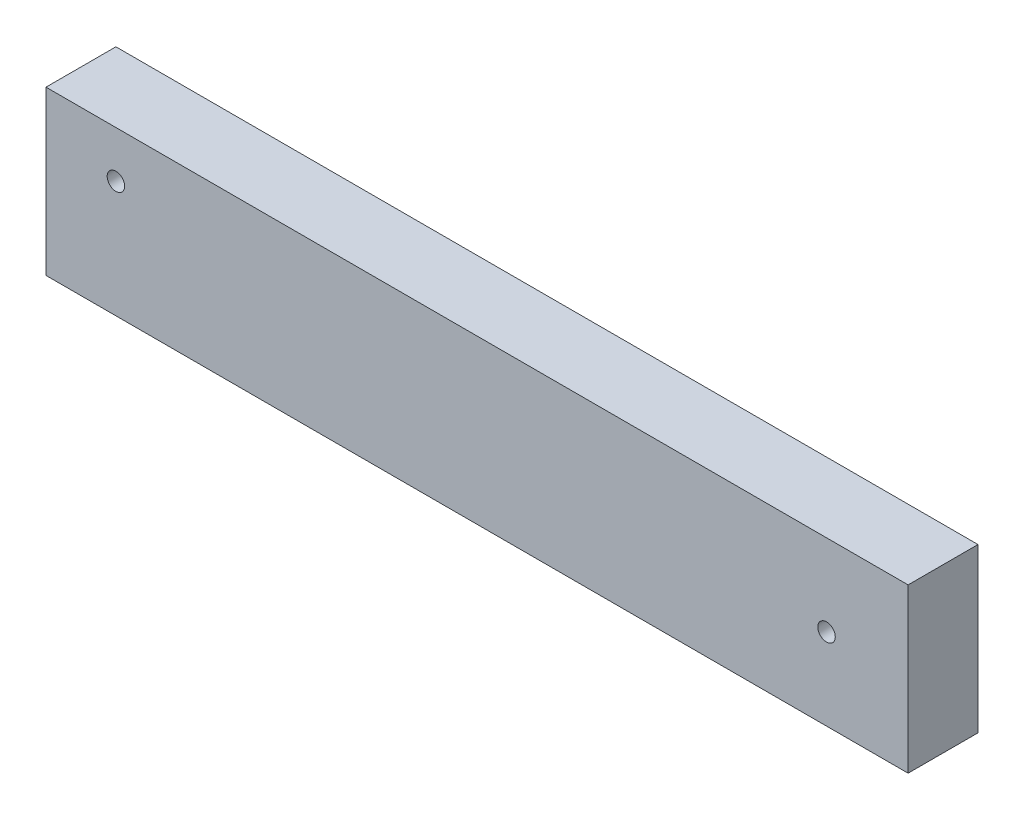
ISO-10303-21;
HEADER;
FILE_DESCRIPTION(('STEP AP214'),'2;1');
FILE_NAME('part.step','',(''),(''),'','','');
FILE_SCHEMA(('AUTOMOTIVE_DESIGN { 1 0 10303 214 1 1 1 1 }'));
ENDSEC;
DATA;
#1=APPLICATION_CONTEXT('core data for automotive mechanical design processes');
#2=APPLICATION_PROTOCOL_DEFINITION('international standard','automotive_design',2000,#1);
#3=PRODUCT_CONTEXT('',#1,'mechanical');
#4=PRODUCT('Part','Part','',(#3));
#5=PRODUCT_RELATED_PRODUCT_CATEGORY('part','',(#4));
#6=PRODUCT_DEFINITION_FORMATION('','',#4);
#7=PRODUCT_DEFINITION_CONTEXT('part definition',#1,'design');
#8=PRODUCT_DEFINITION('design','',#6,#7);
#9=PRODUCT_DEFINITION_SHAPE('','',#8);
#10=(LENGTH_UNIT() NAMED_UNIT(*) SI_UNIT(.MILLI.,.METRE.));
#11=(NAMED_UNIT(*) PLANE_ANGLE_UNIT() SI_UNIT($,.RADIAN.));
#12=(NAMED_UNIT(*) SI_UNIT($,.STERADIAN.) SOLID_ANGLE_UNIT());
#13=UNCERTAINTY_MEASURE_WITH_UNIT(LENGTH_MEASURE(1.E-05),#10,'distance_accuracy_value','');
#14=(GEOMETRIC_REPRESENTATION_CONTEXT(3) GLOBAL_UNCERTAINTY_ASSIGNED_CONTEXT((#13)) GLOBAL_UNIT_ASSIGNED_CONTEXT((#10,
#11,#12)) REPRESENTATION_CONTEXT('',''));
#15=CARTESIAN_POINT('',(0.,0.,0.));
#16=DIRECTION('',(0.,0.,1.));
#17=DIRECTION('',(1.,0.,0.));
#18=AXIS2_PLACEMENT_3D('',#15,#16,#17);
#19=CARTESIAN_POINT('',(0.,0.,38.1));
#20=DIRECTION('',(1.,0.,0.));
#21=DIRECTION('',(0.,0.,-1.));
#22=AXIS2_PLACEMENT_3D('',#19,#20,#21);
#23=PLANE('',#22);
#24=DIRECTION('',(0.,-1.,0.));
#25=VECTOR('',#24,1.);
#26=CARTESIAN_POINT('',(0.,0.,0.));
#27=LINE('',#26,#25);
#28=CARTESIAN_POINT('',(0.,88.9,0.));
#29=VERTEX_POINT('',#28);
#30=CARTESIAN_POINT('',(0.,0.,0.));
#31=VERTEX_POINT('',#30);
#32=EDGE_CURVE('E107',#29,#31,#27,.T.);
#33=ORIENTED_EDGE('',*,*,#32,.T.);
#34=DIRECTION('',(0.,0.,-1.));
#35=VECTOR('',#34,1.);
#36=CARTESIAN_POINT('',(0.,0.,38.1));
#37=LINE('',#36,#35);
#38=CARTESIAN_POINT('',(0.,0.,38.1));
#39=VERTEX_POINT('',#38);
#40=EDGE_CURVE('E11',#39,#31,#37,.T.);
#41=ORIENTED_EDGE('',*,*,#40,.F.);
#42=DIRECTION('',(0.,-1.,0.));
#43=VECTOR('',#42,1.);
#44=CARTESIAN_POINT('',(0.,0.,38.1));
#45=LINE('',#44,#43);
#46=CARTESIAN_POINT('',(0.,88.9,38.1));
#47=VERTEX_POINT('',#46);
#48=EDGE_CURVE('E91',#47,#39,#45,.T.);
#49=ORIENTED_EDGE('',*,*,#48,.F.);
#50=DIRECTION('',(0.,0.,-1.));
#51=VECTOR('',#50,1.);
#52=CARTESIAN_POINT('',(0.,88.9,38.1));
#53=LINE('',#52,#51);
#54=EDGE_CURVE('E103',#47,#29,#53,.T.);
#55=ORIENTED_EDGE('',*,*,#54,.T.);
#56=EDGE_LOOP('',(#33,#41,#49,#55));
#57=FACE_BOUND('',#56,.T.);
#58=ADVANCED_FACE('F39',(#57),#23,.F.);
#59=CARTESIAN_POINT('',(0.,0.,38.1));
#60=DIRECTION('',(0.,1.,0.));
#61=DIRECTION('',(0.,0.,1.));
#62=AXIS2_PLACEMENT_3D('',#59,#60,#61);
#63=PLANE('',#62);
#64=DIRECTION('',(1.,0.,0.));
#65=VECTOR('',#64,1.);
#66=CARTESIAN_POINT('',(0.,0.,0.));
#67=LINE('',#66,#65);
#68=CARTESIAN_POINT('',(469.9,0.,0.));
#69=VERTEX_POINT('',#68);
#70=EDGE_CURVE('E96',#31,#69,#67,.T.);
#71=ORIENTED_EDGE('',*,*,#70,.T.);
#72=DIRECTION('',(0.,0.,-1.));
#73=VECTOR('',#72,1.);
#74=CARTESIAN_POINT('',(469.9,0.,38.1));
#75=LINE('',#74,#73);
#76=CARTESIAN_POINT('',(469.9,0.,38.1));
#77=VERTEX_POINT('',#76);
#78=EDGE_CURVE('E48',#77,#69,#75,.T.);
#79=ORIENTED_EDGE('',*,*,#78,.F.);
#80=DIRECTION('',(1.,0.,0.));
#81=VECTOR('',#80,1.);
#82=CARTESIAN_POINT('',(0.,0.,38.1));
#83=LINE('',#82,#81);
#84=EDGE_CURVE('E86',#39,#77,#83,.T.);
#85=ORIENTED_EDGE('',*,*,#84,.F.);
#86=ORIENTED_EDGE('',*,*,#40,.T.);
#87=EDGE_LOOP('',(#71,#79,#85,#86));
#88=FACE_BOUND('',#87,.T.);
#89=ADVANCED_FACE('F95',(#88),#63,.F.);
#90=CARTESIAN_POINT('',(469.9,0.,38.1));
#91=DIRECTION('',(-1.,0.,0.));
#92=DIRECTION('',(0.,0.,1.));
#93=AXIS2_PLACEMENT_3D('',#90,#91,#92);
#94=PLANE('',#93);
#95=DIRECTION('',(0.,1.,0.));
#96=VECTOR('',#95,1.);
#97=CARTESIAN_POINT('',(469.9,0.,0.));
#98=LINE('',#97,#96);
#99=CARTESIAN_POINT('',(469.9,88.9,0.));
#100=VERTEX_POINT('',#99);
#101=EDGE_CURVE('E73',#69,#100,#98,.T.);
#102=ORIENTED_EDGE('',*,*,#101,.T.);
#103=DIRECTION('',(0.,0.,-1.));
#104=VECTOR('',#103,1.);
#105=CARTESIAN_POINT('',(469.9,88.9,38.1));
#106=LINE('',#105,#104);
#107=CARTESIAN_POINT('',(469.9,88.9,38.1));
#108=VERTEX_POINT('',#107);
#109=EDGE_CURVE('E98',#108,#100,#106,.T.);
#110=ORIENTED_EDGE('',*,*,#109,.F.);
#111=DIRECTION('',(0.,1.,0.));
#112=VECTOR('',#111,1.);
#113=CARTESIAN_POINT('',(469.9,0.,38.1));
#114=LINE('',#113,#112);
#115=EDGE_CURVE('E89',#77,#108,#114,.T.);
#116=ORIENTED_EDGE('',*,*,#115,.F.);
#117=ORIENTED_EDGE('',*,*,#78,.T.);
#118=EDGE_LOOP('',(#102,#110,#116,#117));
#119=FACE_BOUND('',#118,.T.);
#120=ADVANCED_FACE('F99',(#119),#94,.F.);
#121=CARTESIAN_POINT('',(0.,88.9,38.1));
#122=DIRECTION('',(0.,-1.,0.));
#123=DIRECTION('',(0.,0.,-1.));
#124=AXIS2_PLACEMENT_3D('',#121,#122,#123);
#125=PLANE('',#124);
#126=DIRECTION('',(-1.,0.,0.));
#127=VECTOR('',#126,1.);
#128=CARTESIAN_POINT('',(0.,88.9,0.));
#129=LINE('',#128,#127);
#130=EDGE_CURVE('E79',#100,#29,#129,.T.);
#131=ORIENTED_EDGE('',*,*,#130,.T.);
#132=ORIENTED_EDGE('',*,*,#54,.F.);
#133=DIRECTION('',(-1.,0.,0.));
#134=VECTOR('',#133,1.);
#135=CARTESIAN_POINT('',(0.,88.9,38.1));
#136=LINE('',#135,#134);
#137=EDGE_CURVE('E56',#108,#47,#136,.T.);
#138=ORIENTED_EDGE('',*,*,#137,.F.);
#139=ORIENTED_EDGE('',*,*,#109,.T.);
#140=EDGE_LOOP('',(#131,#132,#138,#139));
#141=FACE_BOUND('',#140,.T.);
#142=ADVANCED_FACE('F121',(#141),#125,.F.);
#143=CARTESIAN_POINT('',(0.,0.,38.1));
#144=DIRECTION('',(0.,0.,-1.));
#145=DIRECTION('',(-1.,0.,0.));
#146=AXIS2_PLACEMENT_3D('',#143,#144,#145);
#147=PLANE('',#146);
#148=CARTESIAN_POINT('',(38.1,63.5,38.1));
#149=DIRECTION('',(0.,0.,1.));
#150=DIRECTION('',(1.,0.,0.));
#151=AXIS2_PLACEMENT_3D('',#148,#149,#150);
#152=CIRCLE('',#151,4.7625);
#153=CARTESIAN_POINT('',(42.8625,63.5,38.1));
#154=VERTEX_POINT('',#153);
#155=EDGE_CURVE('E136',#154,#154,#152,.T.);
#156=ORIENTED_EDGE('',*,*,#155,.F.);
#157=EDGE_LOOP('',(#156));
#158=FACE_BOUND('',#157,.T.);
#159=CARTESIAN_POINT('',(425.45,44.45,38.1));
#160=DIRECTION('',(0.,0.,1.));
#161=DIRECTION('',(1.,0.,0.));
#162=AXIS2_PLACEMENT_3D('',#159,#160,#161);
#163=CIRCLE('',#162,4.76250000000001);
#164=CARTESIAN_POINT('',(430.2125,44.45,38.1));
#165=VERTEX_POINT('',#164);
#166=EDGE_CURVE('E128',#165,#165,#163,.T.);
#167=ORIENTED_EDGE('',*,*,#166,.F.);
#168=EDGE_LOOP('',(#167));
#169=FACE_BOUND('',#168,.T.);
#170=ORIENTED_EDGE('',*,*,#48,.T.);
#171=ORIENTED_EDGE('',*,*,#84,.T.);
#172=ORIENTED_EDGE('',*,*,#115,.T.);
#173=ORIENTED_EDGE('',*,*,#137,.T.);
#174=EDGE_LOOP('',(#170,#171,#172,#173));
#175=FACE_BOUND('',#174,.T.);
#176=ADVANCED_FACE('F87',(#158,#169,#175),#147,.F.);
#177=CARTESIAN_POINT('',(0.,0.,0.));
#178=DIRECTION('',(0.,0.,-1.));
#179=DIRECTION('',(-1.,0.,0.));
#180=AXIS2_PLACEMENT_3D('',#177,#178,#179);
#181=PLANE('',#180);
#182=CARTESIAN_POINT('',(38.1,63.5,0.));
#183=DIRECTION('',(0.,0.,1.));
#184=DIRECTION('',(1.,0.,0.));
#185=AXIS2_PLACEMENT_3D('',#182,#183,#184);
#186=CIRCLE('',#185,4.7625);
#187=CARTESIAN_POINT('',(42.8625,63.5,0.));
#188=VERTEX_POINT('',#187);
#189=EDGE_CURVE('E132',#188,#188,#186,.T.);
#190=ORIENTED_EDGE('',*,*,#189,.T.);
#191=EDGE_LOOP('',(#190));
#192=FACE_BOUND('',#191,.T.);
#193=CARTESIAN_POINT('',(425.45,44.45,0.));
#194=DIRECTION('',(0.,0.,1.));
#195=DIRECTION('',(1.,0.,0.));
#196=AXIS2_PLACEMENT_3D('',#193,#194,#195);
#197=CIRCLE('',#196,4.76250000000001);
#198=CARTESIAN_POINT('',(430.2125,44.45,0.));
#199=VERTEX_POINT('',#198);
#200=EDGE_CURVE('E111',#199,#199,#197,.T.);
#201=ORIENTED_EDGE('',*,*,#200,.T.);
#202=EDGE_LOOP('',(#201));
#203=FACE_BOUND('',#202,.T.);
#204=ORIENTED_EDGE('',*,*,#32,.F.);
#205=ORIENTED_EDGE('',*,*,#130,.F.);
#206=ORIENTED_EDGE('',*,*,#101,.F.);
#207=ORIENTED_EDGE('',*,*,#70,.F.);
#208=EDGE_LOOP('',(#204,#205,#206,#207));
#209=FACE_BOUND('',#208,.T.);
#210=ADVANCED_FACE('F124',(#192,#203,#209),#181,.T.);
#211=CARTESIAN_POINT('',(425.45,44.45,0.));
#212=DIRECTION('',(0.,0.,1.));
#213=DIRECTION('',(1.,0.,0.));
#214=AXIS2_PLACEMENT_3D('',#211,#212,#213);
#215=CYLINDRICAL_SURFACE('',#214,4.76250000000001);
#216=CARTESIAN_POINT('',(430.2125,44.45,0.));
#217=CARTESIAN_POINT('',(430.2125,44.45,0.396875));
#218=CARTESIAN_POINT('',(430.2125,44.45,0.79375));
#219=CARTESIAN_POINT('',(430.2125,44.45,1.5875));
#220=CARTESIAN_POINT('',(430.2125,44.45,1.984375));
#221=CARTESIAN_POINT('',(430.2125,44.45,2.778125));
#222=CARTESIAN_POINT('',(430.2125,44.45,3.175));
#223=CARTESIAN_POINT('',(430.2125,44.45,3.96875));
#224=CARTESIAN_POINT('',(430.2125,44.45,4.365625));
#225=CARTESIAN_POINT('',(430.2125,44.45,5.159375));
#226=CARTESIAN_POINT('',(430.2125,44.45,5.55625));
#227=CARTESIAN_POINT('',(430.2125,44.45,6.35));
#228=CARTESIAN_POINT('',(430.2125,44.45,6.746875));
#229=CARTESIAN_POINT('',(430.2125,44.45,7.540625));
#230=CARTESIAN_POINT('',(430.2125,44.45,7.9375));
#231=CARTESIAN_POINT('',(430.2125,44.45,8.73125));
#232=CARTESIAN_POINT('',(430.2125,44.45,9.128125));
#233=CARTESIAN_POINT('',(430.2125,44.45,9.921875));
#234=CARTESIAN_POINT('',(430.2125,44.45,10.31875));
#235=CARTESIAN_POINT('',(430.2125,44.45,11.1125));
#236=CARTESIAN_POINT('',(430.2125,44.45,11.509375));
#237=CARTESIAN_POINT('',(430.2125,44.45,12.303125));
#238=CARTESIAN_POINT('',(430.2125,44.45,12.7));
#239=CARTESIAN_POINT('',(430.2125,44.45,13.49375));
#240=CARTESIAN_POINT('',(430.2125,44.45,13.890625));
#241=CARTESIAN_POINT('',(430.2125,44.45,14.684375));
#242=CARTESIAN_POINT('',(430.2125,44.45,15.08125));
#243=CARTESIAN_POINT('',(430.2125,44.45,15.875));
#244=CARTESIAN_POINT('',(430.2125,44.45,16.271875));
#245=CARTESIAN_POINT('',(430.2125,44.45,17.065625));
#246=CARTESIAN_POINT('',(430.2125,44.45,17.4625));
#247=CARTESIAN_POINT('',(430.2125,44.45,18.25625));
#248=CARTESIAN_POINT('',(430.2125,44.45,18.653125));
#249=CARTESIAN_POINT('',(430.2125,44.45,19.446875));
#250=CARTESIAN_POINT('',(430.2125,44.45,19.84375));
#251=CARTESIAN_POINT('',(430.2125,44.45,20.6375));
#252=CARTESIAN_POINT('',(430.2125,44.45,21.034375));
#253=CARTESIAN_POINT('',(430.2125,44.45,21.828125));
#254=CARTESIAN_POINT('',(430.2125,44.45,22.225));
#255=CARTESIAN_POINT('',(430.2125,44.45,23.01875));
#256=CARTESIAN_POINT('',(430.2125,44.45,23.415625));
#257=CARTESIAN_POINT('',(430.2125,44.45,24.209375));
#258=CARTESIAN_POINT('',(430.2125,44.45,24.60625));
#259=CARTESIAN_POINT('',(430.2125,44.45,25.4));
#260=CARTESIAN_POINT('',(430.2125,44.45,25.796875));
#261=CARTESIAN_POINT('',(430.2125,44.45,26.590625));
#262=CARTESIAN_POINT('',(430.2125,44.45,26.9875));
#263=CARTESIAN_POINT('',(430.2125,44.45,27.78125));
#264=CARTESIAN_POINT('',(430.2125,44.45,28.178125));
#265=CARTESIAN_POINT('',(430.2125,44.45,28.971875));
#266=CARTESIAN_POINT('',(430.2125,44.45,29.36875));
#267=CARTESIAN_POINT('',(430.2125,44.45,30.1625));
#268=CARTESIAN_POINT('',(430.2125,44.45,30.559375));
#269=CARTESIAN_POINT('',(430.2125,44.45,31.353125));
#270=CARTESIAN_POINT('',(430.2125,44.45,31.75));
#271=CARTESIAN_POINT('',(430.2125,44.45,32.54375));
#272=CARTESIAN_POINT('',(430.2125,44.45,32.940625));
#273=CARTESIAN_POINT('',(430.2125,44.45,33.734375));
#274=CARTESIAN_POINT('',(430.2125,44.45,34.13125));
#275=CARTESIAN_POINT('',(430.2125,44.45,34.925));
#276=CARTESIAN_POINT('',(430.2125,44.45,35.321875));
#277=CARTESIAN_POINT('',(430.2125,44.45,36.115625));
#278=CARTESIAN_POINT('',(430.2125,44.45,36.5125));
#279=CARTESIAN_POINT('',(430.2125,44.45,37.30625));
#280=CARTESIAN_POINT('',(430.2125,44.45,37.703125));
#281=CARTESIAN_POINT('',(430.2125,44.45,38.1));
#282=B_SPLINE_CURVE_WITH_KNOTS('',3,(#216,#217,#218,#219,#220,#221,#222,#223,#224,#225,#226,
#227,#228,#229,#230,#231,#232,#233,#234,#235,#236,#237,#238,#239,#240,#241,#242,#243,#244,#245,
#246,#247,#248,#249,#250,#251,#252,#253,#254,#255,#256,#257,#258,#259,#260,#261,#262,#263,#264,
#265,#266,#267,#268,#269,#270,#271,#272,#273,#274,#275,#276,#277,#278,#279,#280,#281),
.UNSPECIFIED.,.F.,.F.,(4,2,2,2,2,2,2,2,2,2,2,2,2,2,2,2,2,2,2,2,2,2,2,2,2,2,2,2,2,2,2,2,4),(0.,
1.190625,2.38125,3.571875,4.7625,5.953125,7.14375,8.334375,9.525,10.715625,11.90625,13.096875,
14.2875,15.478125,16.66875,17.859375,19.05,20.240625,21.43125,22.621875,23.8125,25.003125,
26.19375,27.384375,28.575,29.765625,30.95625,32.146875,33.3375,34.528125,35.71875,36.909375,
38.1),.UNSPECIFIED.);
#283=EDGE_CURVE('BSEAM149',#199,#165,#282,.T.);
#284=ORIENTED_EDGE('',*,*,#200,.F.);
#285=ORIENTED_EDGE('',*,*,#166,.T.);
#286=ORIENTED_EDGE('',*,*,#283,.T.);
#287=ORIENTED_EDGE('',*,*,#283,.F.);
#288=EDGE_LOOP('',(#284,#286,#285,#287));
#289=FACE_BOUND('',#288,.T.);
#290=ADVANCED_FACE('F149',(#289),#215,.F.);
#291=CARTESIAN_POINT('',(38.1,63.5,0.));
#292=DIRECTION('',(0.,0.,1.));
#293=DIRECTION('',(1.,0.,0.));
#294=AXIS2_PLACEMENT_3D('',#291,#292,#293);
#295=CYLINDRICAL_SURFACE('',#294,4.7625);
#296=CARTESIAN_POINT('',(42.8625,63.5,0.));
#297=CARTESIAN_POINT('',(42.8625,63.5,0.396875));
#298=CARTESIAN_POINT('',(42.8625,63.5,0.79375));
#299=CARTESIAN_POINT('',(42.8625,63.5,1.5875));
#300=CARTESIAN_POINT('',(42.8625,63.5,1.984375));
#301=CARTESIAN_POINT('',(42.8625,63.5,2.778125));
#302=CARTESIAN_POINT('',(42.8625,63.5,3.175));
#303=CARTESIAN_POINT('',(42.8625,63.5,3.96875));
#304=CARTESIAN_POINT('',(42.8625,63.5,4.365625));
#305=CARTESIAN_POINT('',(42.8625,63.5,5.159375));
#306=CARTESIAN_POINT('',(42.8625,63.5,5.55625));
#307=CARTESIAN_POINT('',(42.8625,63.5,6.35));
#308=CARTESIAN_POINT('',(42.8625,63.5,6.746875));
#309=CARTESIAN_POINT('',(42.8625,63.5,7.540625));
#310=CARTESIAN_POINT('',(42.8625,63.5,7.9375));
#311=CARTESIAN_POINT('',(42.8625,63.5,8.73125));
#312=CARTESIAN_POINT('',(42.8625,63.5,9.128125));
#313=CARTESIAN_POINT('',(42.8625,63.5,9.921875));
#314=CARTESIAN_POINT('',(42.8625,63.5,10.31875));
#315=CARTESIAN_POINT('',(42.8625,63.5,11.1125));
#316=CARTESIAN_POINT('',(42.8625,63.5,11.509375));
#317=CARTESIAN_POINT('',(42.8625,63.5,12.303125));
#318=CARTESIAN_POINT('',(42.8625,63.5,12.7));
#319=CARTESIAN_POINT('',(42.8625,63.5,13.49375));
#320=CARTESIAN_POINT('',(42.8625,63.5,13.890625));
#321=CARTESIAN_POINT('',(42.8625,63.5,14.684375));
#322=CARTESIAN_POINT('',(42.8625,63.5,15.08125));
#323=CARTESIAN_POINT('',(42.8625,63.5,15.875));
#324=CARTESIAN_POINT('',(42.8625,63.5,16.271875));
#325=CARTESIAN_POINT('',(42.8625,63.5,17.065625));
#326=CARTESIAN_POINT('',(42.8625,63.5,17.4625));
#327=CARTESIAN_POINT('',(42.8625,63.5,18.25625));
#328=CARTESIAN_POINT('',(42.8625,63.5,18.653125));
#329=CARTESIAN_POINT('',(42.8625,63.5,19.446875));
#330=CARTESIAN_POINT('',(42.8625,63.5,19.84375));
#331=CARTESIAN_POINT('',(42.8625,63.5,20.6375));
#332=CARTESIAN_POINT('',(42.8625,63.5,21.034375));
#333=CARTESIAN_POINT('',(42.8625,63.5,21.828125));
#334=CARTESIAN_POINT('',(42.8625,63.5,22.225));
#335=CARTESIAN_POINT('',(42.8625,63.5,23.01875));
#336=CARTESIAN_POINT('',(42.8625,63.5,23.415625));
#337=CARTESIAN_POINT('',(42.8625,63.5,24.209375));
#338=CARTESIAN_POINT('',(42.8625,63.5,24.60625));
#339=CARTESIAN_POINT('',(42.8625,63.5,25.4));
#340=CARTESIAN_POINT('',(42.8625,63.5,25.796875));
#341=CARTESIAN_POINT('',(42.8625,63.5,26.590625));
#342=CARTESIAN_POINT('',(42.8625,63.5,26.9875));
#343=CARTESIAN_POINT('',(42.8625,63.5,27.78125));
#344=CARTESIAN_POINT('',(42.8625,63.5,28.178125));
#345=CARTESIAN_POINT('',(42.8625,63.5,28.971875));
#346=CARTESIAN_POINT('',(42.8625,63.5,29.36875));
#347=CARTESIAN_POINT('',(42.8625,63.5,30.1625));
#348=CARTESIAN_POINT('',(42.8625,63.5,30.559375));
#349=CARTESIAN_POINT('',(42.8625,63.5,31.353125));
#350=CARTESIAN_POINT('',(42.8625,63.5,31.75));
#351=CARTESIAN_POINT('',(42.8625,63.5,32.54375));
#352=CARTESIAN_POINT('',(42.8625,63.5,32.940625));
#353=CARTESIAN_POINT('',(42.8625,63.5,33.734375));
#354=CARTESIAN_POINT('',(42.8625,63.5,34.13125));
#355=CARTESIAN_POINT('',(42.8625,63.5,34.925));
#356=CARTESIAN_POINT('',(42.8625,63.5,35.321875));
#357=CARTESIAN_POINT('',(42.8625,63.5,36.115625));
#358=CARTESIAN_POINT('',(42.8625,63.5,36.5125));
#359=CARTESIAN_POINT('',(42.8625,63.5,37.30625));
#360=CARTESIAN_POINT('',(42.8625,63.5,37.703125));
#361=CARTESIAN_POINT('',(42.8625,63.5,38.1));
#362=B_SPLINE_CURVE_WITH_KNOTS('',3,(#296,#297,#298,#299,#300,#301,#302,#303,#304,#305,#306,
#307,#308,#309,#310,#311,#312,#313,#314,#315,#316,#317,#318,#319,#320,#321,#322,#323,#324,#325,
#326,#327,#328,#329,#330,#331,#332,#333,#334,#335,#336,#337,#338,#339,#340,#341,#342,#343,#344,
#345,#346,#347,#348,#349,#350,#351,#352,#353,#354,#355,#356,#357,#358,#359,#360,#361),
.UNSPECIFIED.,.F.,.F.,(4,2,2,2,2,2,2,2,2,2,2,2,2,2,2,2,2,2,2,2,2,2,2,2,2,2,2,2,2,2,2,2,4),(0.,
1.190625,2.38125,3.571875,4.7625,5.953125,7.14375,8.334375,9.525,10.715625,11.90625,13.096875,
14.2875,15.478125,16.66875,17.859375,19.05,20.240625,21.43125,22.621875,23.8125,25.003125,
26.19375,27.384375,28.575,29.765625,30.95625,32.146875,33.3375,34.528125,35.71875,36.909375,
38.1),.UNSPECIFIED.);
#363=EDGE_CURVE('BSEAM146',#188,#154,#362,.T.);
#364=ORIENTED_EDGE('',*,*,#189,.F.);
#365=ORIENTED_EDGE('',*,*,#155,.T.);
#366=ORIENTED_EDGE('',*,*,#363,.T.);
#367=ORIENTED_EDGE('',*,*,#363,.F.);
#368=EDGE_LOOP('',(#364,#366,#365,#367));
#369=FACE_BOUND('',#368,.T.);
#370=ADVANCED_FACE('F146',(#369),#295,.F.);
#371=CLOSED_SHELL('',(#58,#89,#120,#142,#176,#210,#290,#370));
#372=MANIFOLD_SOLID_BREP('B2',#371);
#373=ADVANCED_BREP_SHAPE_REPRESENTATION('',(#18,#372),#14);
#374=SHAPE_DEFINITION_REPRESENTATION(#9,#373);
ENDSEC;
END-ISO-10303-21;
